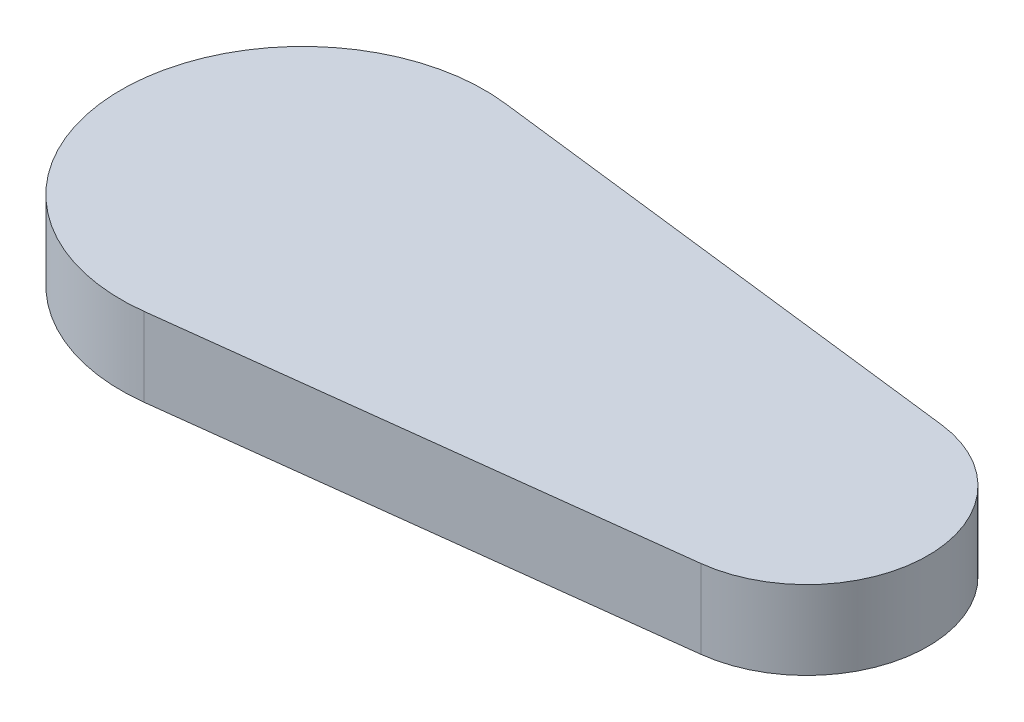
ISO-10303-21;
HEADER;
FILE_DESCRIPTION(('STEP AP214'),'2;1');
FILE_NAME('part.step','',(''),(''),'','','');
FILE_SCHEMA(('AUTOMOTIVE_DESIGN { 1 0 10303 214 1 1 1 1 }'));
ENDSEC;
DATA;
#1=APPLICATION_CONTEXT('core data for automotive mechanical design processes');
#2=APPLICATION_PROTOCOL_DEFINITION('international standard','automotive_design',2000,#1);
#3=PRODUCT_CONTEXT('',#1,'mechanical');
#4=PRODUCT('Part','Part','',(#3));
#5=PRODUCT_RELATED_PRODUCT_CATEGORY('part','',(#4));
#6=PRODUCT_DEFINITION_FORMATION('','',#4);
#7=PRODUCT_DEFINITION_CONTEXT('part definition',#1,'design');
#8=PRODUCT_DEFINITION('design','',#6,#7);
#9=PRODUCT_DEFINITION_SHAPE('','',#8);
#10=(LENGTH_UNIT() NAMED_UNIT(*) SI_UNIT(.MILLI.,.METRE.));
#11=(NAMED_UNIT(*) PLANE_ANGLE_UNIT() SI_UNIT($,.RADIAN.));
#12=(NAMED_UNIT(*) SI_UNIT($,.STERADIAN.) SOLID_ANGLE_UNIT());
#13=UNCERTAINTY_MEASURE_WITH_UNIT(LENGTH_MEASURE(1.E-05),#10,'distance_accuracy_value','');
#14=(GEOMETRIC_REPRESENTATION_CONTEXT(3) GLOBAL_UNCERTAINTY_ASSIGNED_CONTEXT((#13)) GLOBAL_UNIT_ASSIGNED_CONTEXT((#10,
#11,#12)) REPRESENTATION_CONTEXT('',''));
#15=CARTESIAN_POINT('',(0.,0.,0.));
#16=DIRECTION('',(0.,0.,1.));
#17=DIRECTION('',(1.,0.,0.));
#18=AXIS2_PLACEMENT_3D('',#15,#16,#17);
#19=CARTESIAN_POINT('',(0.,2.6,0.));
#20=DIRECTION('',(0.,-1.,0.));
#21=DIRECTION('',(0.,0.,-1.));
#22=AXIS2_PLACEMENT_3D('',#19,#20,#21);
#23=CYLINDRICAL_SURFACE('',#22,6.);
#24=CARTESIAN_POINT('',(0.,0.,0.));
#25=DIRECTION('',(0.,1.,0.));
#26=DIRECTION('',(0.,0.,1.));
#27=AXIS2_PLACEMENT_3D('',#24,#25,#26);
#28=CIRCLE('',#27,6.);
#29=CARTESIAN_POINT('',(0.720720720720721,0.,-5.95655618984022));
#30=VERTEX_POINT('',#29);
#31=CARTESIAN_POINT('',(0.72072072072072,0.,5.95655618984022));
#32=VERTEX_POINT('',#31);
#33=EDGE_CURVE('E109',#30,#32,#28,.T.);
#34=ORIENTED_EDGE('',*,*,#33,.T.);
#35=DIRECTION('',(0.,-1.,0.));
#36=VECTOR('',#35,1.);
#37=CARTESIAN_POINT('',(0.72072072072072,2.6,5.95655618984022));
#38=LINE('',#37,#36);
#39=CARTESIAN_POINT('',(0.72072072072072,2.6,5.95655618984022));
#40=VERTEX_POINT('',#39);
#41=EDGE_CURVE('E11',#40,#32,#38,.T.);
#42=ORIENTED_EDGE('',*,*,#41,.F.);
#43=CARTESIAN_POINT('',(0.,2.6,0.));
#44=DIRECTION('',(0.,1.,0.));
#45=DIRECTION('',(0.,0.,1.));
#46=AXIS2_PLACEMENT_3D('',#43,#44,#45);
#47=CIRCLE('',#46,6.);
#48=CARTESIAN_POINT('',(0.720720720720721,2.6,-5.95655618984022));
#49=VERTEX_POINT('',#48);
#50=EDGE_CURVE('E91',#49,#40,#47,.T.);
#51=ORIENTED_EDGE('',*,*,#50,.F.);
#52=DIRECTION('',(0.,-1.,0.));
#53=VECTOR('',#52,1.);
#54=CARTESIAN_POINT('',(0.720720720720721,2.6,-5.95655618984022));
#55=LINE('',#54,#53);
#56=EDGE_CURVE('E58',#49,#30,#55,.T.);
#57=ORIENTED_EDGE('',*,*,#56,.T.);
#58=EDGE_LOOP('',(#34,#42,#51,#57));
#59=FACE_BOUND('',#58,.T.);
#60=ADVANCED_FACE('F41',(#59),#23,.T.);
#61=CARTESIAN_POINT('',(0.72072072072072,2.6,5.95655618984022));
#62=DIRECTION('',(-0.12012012012012,0.,-0.99275936497337));
#63=DIRECTION('',(-0.99275936497337,0.,0.12012012012012));
#64=AXIS2_PLACEMENT_3D('',#61,#62,#63);
#65=PLANE('',#64);
#66=DIRECTION('',(0.99275936497337,0.,-0.12012012012012));
#67=VECTOR('',#66,1.);
#68=CARTESIAN_POINT('',(0.72072072072072,0.,5.95655618984022));
#69=LINE('',#68,#67);
#70=CARTESIAN_POINT('',(17.1304804804805,0.,3.97103745989348));
#71=VERTEX_POINT('',#70);
#72=EDGE_CURVE('E97',#32,#71,#69,.T.);
#73=ORIENTED_EDGE('',*,*,#72,.T.);
#74=DIRECTION('',(0.,-1.,0.));
#75=VECTOR('',#74,1.);
#76=CARTESIAN_POINT('',(17.1304804804805,2.6,3.97103745989348));
#77=LINE('',#76,#75);
#78=CARTESIAN_POINT('',(17.1304804804805,2.6,3.97103745989348));
#79=VERTEX_POINT('',#78);
#80=EDGE_CURVE('E50',#79,#71,#77,.T.);
#81=ORIENTED_EDGE('',*,*,#80,.F.);
#82=DIRECTION('',(0.99275936497337,0.,-0.12012012012012));
#83=VECTOR('',#82,1.);
#84=CARTESIAN_POINT('',(0.72072072072072,2.6,5.95655618984022));
#85=LINE('',#84,#83);
#86=EDGE_CURVE('E84',#40,#79,#85,.T.);
#87=ORIENTED_EDGE('',*,*,#86,.F.);
#88=ORIENTED_EDGE('',*,*,#41,.T.);
#89=EDGE_LOOP('',(#73,#81,#87,#88));
#90=FACE_BOUND('',#89,.T.);
#91=ADVANCED_FACE('F96',(#90),#65,.F.);
#92=CARTESIAN_POINT('',(16.65,2.6,0.));
#93=DIRECTION('',(0.,-1.,0.));
#94=DIRECTION('',(0.,0.,-1.));
#95=AXIS2_PLACEMENT_3D('',#92,#93,#94);
#96=CYLINDRICAL_SURFACE('',#95,4.);
#97=CARTESIAN_POINT('',(16.65,0.,0.));
#98=DIRECTION('',(0.,1.,0.));
#99=DIRECTION('',(0.,0.,1.));
#100=AXIS2_PLACEMENT_3D('',#97,#98,#99);
#101=CIRCLE('',#100,4.);
#102=CARTESIAN_POINT('',(17.1304804804805,0.,-3.97103745989348));
#103=VERTEX_POINT('',#102);
#104=EDGE_CURVE('E114',#71,#103,#101,.T.);
#105=ORIENTED_EDGE('',*,*,#104,.T.);
#106=DIRECTION('',(0.,-1.,0.));
#107=VECTOR('',#106,1.);
#108=CARTESIAN_POINT('',(17.1304804804805,2.6,-3.97103745989348));
#109=LINE('',#108,#107);
#110=CARTESIAN_POINT('',(17.1304804804805,2.6,-3.97103745989348));
#111=VERTEX_POINT('',#110);
#112=EDGE_CURVE('E73',#111,#103,#109,.T.);
#113=ORIENTED_EDGE('',*,*,#112,.F.);
#114=CARTESIAN_POINT('',(16.65,2.6,0.));
#115=DIRECTION('',(0.,1.,0.));
#116=DIRECTION('',(0.,0.,1.));
#117=AXIS2_PLACEMENT_3D('',#114,#115,#116);
#118=CIRCLE('',#117,4.);
#119=EDGE_CURVE('E90',#79,#111,#118,.T.);
#120=ORIENTED_EDGE('',*,*,#119,.F.);
#121=ORIENTED_EDGE('',*,*,#80,.T.);
#122=EDGE_LOOP('',(#105,#113,#120,#121));
#123=FACE_BOUND('',#122,.T.);
#124=ADVANCED_FACE('F101',(#123),#96,.T.);
#125=CARTESIAN_POINT('',(0.720720720720721,2.6,-5.95655618984022));
#126=DIRECTION('',(0.12012012012012,0.,-0.992759364973369));
#127=DIRECTION('',(-0.992759364973369,0.,-0.12012012012012));
#128=AXIS2_PLACEMENT_3D('',#125,#126,#127);
#129=PLANE('',#128);
#130=DIRECTION('',(0.99275936497337,0.,0.12012012012012));
#131=VECTOR('',#130,1.);
#132=CARTESIAN_POINT('',(0.720720720720721,0.,-5.95655618984022));
#133=LINE('',#132,#131);
#134=EDGE_CURVE('E117',#30,#103,#133,.T.);
#135=ORIENTED_EDGE('',*,*,#134,.F.);
#136=ORIENTED_EDGE('',*,*,#56,.F.);
#137=DIRECTION('',(0.99275936497337,0.,0.12012012012012));
#138=VECTOR('',#137,1.);
#139=CARTESIAN_POINT('',(0.720720720720721,2.6,-5.95655618984022));
#140=LINE('',#139,#138);
#141=EDGE_CURVE('E103',#49,#111,#140,.T.);
#142=ORIENTED_EDGE('',*,*,#141,.T.);
#143=ORIENTED_EDGE('',*,*,#112,.T.);
#144=EDGE_LOOP('',(#135,#136,#142,#143));
#145=FACE_BOUND('',#144,.T.);
#146=ADVANCED_FACE('F127',(#145),#129,.T.);
#147=CARTESIAN_POINT('',(0.,2.6,0.));
#148=DIRECTION('',(0.,1.,0.));
#149=DIRECTION('',(0.,0.,1.));
#150=AXIS2_PLACEMENT_3D('',#147,#148,#149);
#151=PLANE('',#150);
#152=ORIENTED_EDGE('',*,*,#50,.T.);
#153=ORIENTED_EDGE('',*,*,#86,.T.);
#154=ORIENTED_EDGE('',*,*,#119,.T.);
#155=ORIENTED_EDGE('',*,*,#141,.F.);
#156=EDGE_LOOP('',(#152,#153,#154,#155));
#157=FACE_BOUND('',#156,.T.);
#158=ADVANCED_FACE('F87',(#157),#151,.T.);
#159=CARTESIAN_POINT('',(0.,0.,0.));
#160=DIRECTION('',(0.,1.,0.));
#161=DIRECTION('',(0.,0.,1.));
#162=AXIS2_PLACEMENT_3D('',#159,#160,#161);
#163=PLANE('',#162);
#164=ORIENTED_EDGE('',*,*,#33,.F.);
#165=ORIENTED_EDGE('',*,*,#134,.T.);
#166=ORIENTED_EDGE('',*,*,#104,.F.);
#167=ORIENTED_EDGE('',*,*,#72,.F.);
#168=EDGE_LOOP('',(#164,#165,#166,#167));
#169=FACE_BOUND('',#168,.T.);
#170=ADVANCED_FACE('F126',(#169),#163,.F.);
#171=CLOSED_SHELL('',(#60,#91,#124,#146,#158,#170));
#172=MANIFOLD_SOLID_BREP('B2',#171);
#173=ADVANCED_BREP_SHAPE_REPRESENTATION('',(#18,#172),#14);
#174=SHAPE_DEFINITION_REPRESENTATION(#9,#173);
ENDSEC;
END-ISO-10303-21;
